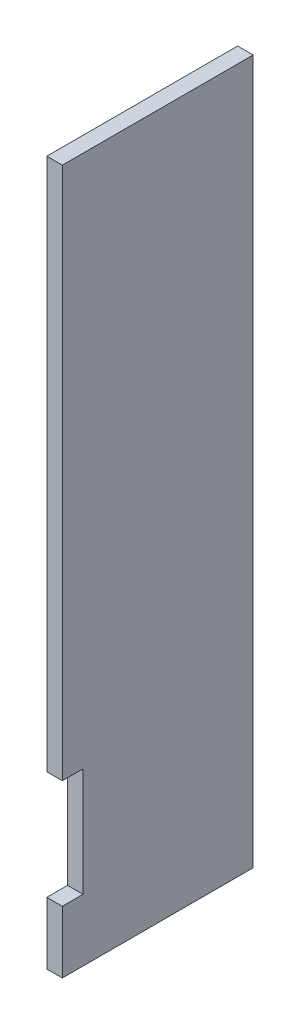
ISO-10303-21;
HEADER;
FILE_DESCRIPTION(('STEP AP214'),'2;1');
FILE_NAME('part.step','',(''),(''),'','','');
FILE_SCHEMA(('AUTOMOTIVE_DESIGN { 1 0 10303 214 1 1 1 1 }'));
ENDSEC;
DATA;
#1=APPLICATION_CONTEXT('core data for automotive mechanical design processes');
#2=APPLICATION_PROTOCOL_DEFINITION('international standard','automotive_design',2000,#1);
#3=PRODUCT_CONTEXT('',#1,'mechanical');
#4=PRODUCT('Part','Part','',(#3));
#5=PRODUCT_RELATED_PRODUCT_CATEGORY('part','',(#4));
#6=PRODUCT_DEFINITION_FORMATION('','',#4);
#7=PRODUCT_DEFINITION_CONTEXT('part definition',#1,'design');
#8=PRODUCT_DEFINITION('design','',#6,#7);
#9=PRODUCT_DEFINITION_SHAPE('','',#8);
#10=(LENGTH_UNIT() NAMED_UNIT(*) SI_UNIT(.MILLI.,.METRE.));
#11=(NAMED_UNIT(*) PLANE_ANGLE_UNIT() SI_UNIT($,.RADIAN.));
#12=(NAMED_UNIT(*) SI_UNIT($,.STERADIAN.) SOLID_ANGLE_UNIT());
#13=UNCERTAINTY_MEASURE_WITH_UNIT(LENGTH_MEASURE(1.E-05),#10,'distance_accuracy_value','');
#14=(GEOMETRIC_REPRESENTATION_CONTEXT(3) GLOBAL_UNCERTAINTY_ASSIGNED_CONTEXT((#13)) GLOBAL_UNIT_ASSIGNED_CONTEXT((#10,
#11,#12)) REPRESENTATION_CONTEXT('',''));
#15=CARTESIAN_POINT('',(0.,0.,0.));
#16=DIRECTION('',(0.,0.,1.));
#17=DIRECTION('',(1.,0.,0.));
#18=AXIS2_PLACEMENT_3D('',#15,#16,#17);
#19=CARTESIAN_POINT('',(-103.32,-116.114624464066,3.));
#20=DIRECTION('',(0.,1.,0.));
#21=DIRECTION('',(-1.,0.,0.));
#22=AXIS2_PLACEMENT_3D('',#19,#20,#21);
#23=PLANE('',#22);
#24=DIRECTION('',(1.,0.,0.));
#25=VECTOR('',#24,1.);
#26=CARTESIAN_POINT('',(-103.32,-116.114624464066,18.));
#27=LINE('',#26,#25);
#28=CARTESIAN_POINT('',(-6.31999999999994,-116.114624464066,18.));
#29=VERTEX_POINT('',#28);
#30=CARTESIAN_POINT('',(-3.31999999999993,-116.114624464066,18.));
#31=VERTEX_POINT('',#30);
#32=EDGE_CURVE('E1722',#29,#31,#27,.T.);
#33=ORIENTED_EDGE('',*,*,#32,.F.);
#34=DIRECTION('',(0.,0.,-1.));
#35=VECTOR('',#34,1.);
#36=CARTESIAN_POINT('',(-6.31999999999994,-116.114624464066,3.));
#37=LINE('',#36,#35);
#38=CARTESIAN_POINT('',(-6.31999999999994,-116.114624464066,-18.87));
#39=VERTEX_POINT('',#38);
#40=EDGE_CURVE('E1713',#29,#39,#37,.T.);
#41=ORIENTED_EDGE('',*,*,#40,.T.);
#42=DIRECTION('',(1.,0.,0.));
#43=VECTOR('',#42,1.);
#44=CARTESIAN_POINT('',(-103.18593626287,-116.114624464066,-18.87));
#45=LINE('',#44,#43);
#46=CARTESIAN_POINT('',(-3.31999999999903,-116.114624464066,-18.87));
#47=VERTEX_POINT('',#46);
#48=EDGE_CURVE('E1721',#39,#47,#45,.T.);
#49=ORIENTED_EDGE('',*,*,#48,.T.);
#50=DIRECTION('',(0.,0.,-1.));
#51=VECTOR('',#50,1.);
#52=CARTESIAN_POINT('',(-3.31999999999993,-116.114624464066,3.));
#53=LINE('',#52,#51);
#54=EDGE_CURVE('E1732',#31,#47,#53,.T.);
#55=ORIENTED_EDGE('',*,*,#54,.F.);
#56=EDGE_LOOP('',(#33,#41,#49,#55));
#57=FACE_BOUND('',#56,.T.);
#58=ADVANCED_FACE('F1642',(#57),#23,.F.);
#59=CARTESIAN_POINT('',(-103.32,19.8853755359338,-20.2264177019235));
#60=DIRECTION('',(0.,-1.,0.));
#61=DIRECTION('',(0.,0.,-1.));
#62=AXIS2_PLACEMENT_3D('',#59,#60,#61);
#63=PLANE('',#62);
#64=DIRECTION('',(-1.,0.,0.));
#65=VECTOR('',#64,1.);
#66=CARTESIAN_POINT('',(-106.64,19.8853755359338,-18.87));
#67=LINE('',#66,#65);
#68=CARTESIAN_POINT('',(-3.31999999999993,19.8853755359338,-18.87));
#69=VERTEX_POINT('',#68);
#70=CARTESIAN_POINT('',(-6.31999999999994,19.8853755359338,-18.87));
#71=VERTEX_POINT('',#70);
#72=EDGE_CURVE('E1664',#69,#71,#67,.T.);
#73=ORIENTED_EDGE('',*,*,#72,.T.);
#74=DIRECTION('',(0.,0.,1.));
#75=VECTOR('',#74,1.);
#76=CARTESIAN_POINT('',(-6.31999999999995,19.8853755359338,-175.));
#77=LINE('',#76,#75);
#78=CARTESIAN_POINT('',(-6.31999999999994,19.8853755359338,18.));
#79=VERTEX_POINT('',#78);
#80=EDGE_CURVE('E1715',#71,#79,#77,.T.);
#81=ORIENTED_EDGE('',*,*,#80,.T.);
#82=DIRECTION('',(1.,0.,0.));
#83=VECTOR('',#82,1.);
#84=CARTESIAN_POINT('',(-178.32,19.8853755359338,18.));
#85=LINE('',#84,#83);
#86=CARTESIAN_POINT('',(-3.31999999999993,19.8853755359338,18.));
#87=VERTEX_POINT('',#86);
#88=EDGE_CURVE('E1723',#79,#87,#85,.T.);
#89=ORIENTED_EDGE('',*,*,#88,.T.);
#90=DIRECTION('',(0.,0.,1.));
#91=VECTOR('',#90,1.);
#92=CARTESIAN_POINT('',(-3.31999999999993,19.8853755359338,-20.2264177019235));
#93=LINE('',#92,#91);
#94=EDGE_CURVE('E1729',#69,#87,#93,.T.);
#95=ORIENTED_EDGE('',*,*,#94,.F.);
#96=EDGE_LOOP('',(#73,#81,#89,#95));
#97=FACE_BOUND('',#96,.T.);
#98=ADVANCED_FACE('F1778',(#97),#63,.F.);
#99=CARTESIAN_POINT('',(-116.140375406953,22.8853755359338,18.));
#100=DIRECTION('',(0.,0.,-1.));
#101=DIRECTION('',(-1.,0.,0.));
#102=AXIS2_PLACEMENT_3D('',#99,#100,#101);
#103=PLANE('',#102);
#104=ORIENTED_EDGE('',*,*,#88,.F.);
#105=DIRECTION('',(0.,1.,0.));
#106=VECTOR('',#105,1.);
#107=CARTESIAN_POINT('',(-6.31999999999992,22.8853755359338,18.));
#108=LINE('',#107,#106);
#109=CARTESIAN_POINT('',(-6.31999999999992,-83.1146244640659,18.));
#110=VERTEX_POINT('',#109);
#111=EDGE_CURVE('E1748',#110,#79,#108,.T.);
#112=ORIENTED_EDGE('',*,*,#111,.F.);
#113=DIRECTION('',(1.,0.,0.));
#114=VECTOR('',#113,1.);
#115=CARTESIAN_POINT('',(-116.140375406953,-83.1146244640659,18.));
#116=LINE('',#115,#114);
#117=CARTESIAN_POINT('',(-3.31999999999993,-83.1146244640659,18.));
#118=VERTEX_POINT('',#117);
#119=EDGE_CURVE('E1728',#110,#118,#116,.T.);
#120=ORIENTED_EDGE('',*,*,#119,.T.);
#121=DIRECTION('',(0.,1.,0.));
#122=VECTOR('',#121,1.);
#123=CARTESIAN_POINT('',(-3.31999999999993,-116.114624464066,18.));
#124=LINE('',#123,#122);
#125=EDGE_CURVE('E1747',#118,#87,#124,.T.);
#126=ORIENTED_EDGE('',*,*,#125,.T.);
#127=EDGE_LOOP('',(#104,#112,#120,#126));
#128=FACE_BOUND('',#127,.T.);
#129=ADVANCED_FACE('F1782',(#128),#103,.F.);
#130=CARTESIAN_POINT('',(-6.31999999999999,22.8853755359338,-18.87));
#131=DIRECTION('',(1.,0.,0.));
#132=DIRECTION('',(0.,-1.,0.));
#133=AXIS2_PLACEMENT_3D('',#130,#131,#132);
#134=PLANE('',#133);
#135=ORIENTED_EDGE('',*,*,#111,.T.);
#136=ORIENTED_EDGE('',*,*,#80,.F.);
#137=DIRECTION('',(0.,1.,0.));
#138=VECTOR('',#137,1.);
#139=CARTESIAN_POINT('',(-6.31999999999994,-116.114624464066,-18.87));
#140=LINE('',#139,#138);
#141=EDGE_CURVE('E1708',#39,#71,#140,.T.);
#142=ORIENTED_EDGE('',*,*,#141,.F.);
#143=ORIENTED_EDGE('',*,*,#40,.F.);
#144=CARTESIAN_POINT('',(-6.31999999999992,-104.114624464066,18.));
#145=VERTEX_POINT('',#144);
#146=EDGE_CURVE('E1740',#29,#145,#108,.T.);
#147=ORIENTED_EDGE('',*,*,#146,.T.);
#148=DIRECTION('',(0.,0.,-1.));
#149=VECTOR('',#148,1.);
#150=CARTESIAN_POINT('',(-6.31999999999764,-104.114624464066,-18.87));
#151=LINE('',#150,#149);
#152=CARTESIAN_POINT('',(-6.31999999999783,-104.114624464066,14.));
#153=VERTEX_POINT('',#152);
#154=EDGE_CURVE('E1746',#145,#153,#151,.T.);
#155=ORIENTED_EDGE('',*,*,#154,.T.);
#156=DIRECTION('',(0.,1.,0.));
#157=VECTOR('',#156,1.);
#158=CARTESIAN_POINT('',(-6.31999999999999,22.8853755359338,14.));
#159=LINE('',#158,#157);
#160=CARTESIAN_POINT('',(-6.31999999999803,-83.1146244640659,14.));
#161=VERTEX_POINT('',#160);
#162=EDGE_CURVE('E13',#153,#161,#159,.T.);
#163=ORIENTED_EDGE('',*,*,#162,.T.);
#164=DIRECTION('',(0.,0.,1.));
#165=VECTOR('',#164,1.);
#166=CARTESIAN_POINT('',(-6.31999999999803,-83.1146244640659,-18.87));
#167=LINE('',#166,#165);
#168=EDGE_CURVE('E1770',#161,#110,#167,.T.);
#169=ORIENTED_EDGE('',*,*,#168,.T.);
#170=EDGE_LOOP('',(#135,#136,#142,#143,#147,#155,#163,#169));
#171=FACE_BOUND('',#170,.T.);
#172=ADVANCED_FACE('F1711',(#171),#134,.F.);
#173=ORIENTED_EDGE('',*,*,#146,.F.);
#174=ORIENTED_EDGE('',*,*,#32,.T.);
#175=CARTESIAN_POINT('',(-3.31999999999993,-104.114624464066,18.));
#176=VERTEX_POINT('',#175);
#177=EDGE_CURVE('E1742',#31,#176,#124,.T.);
#178=ORIENTED_EDGE('',*,*,#177,.T.);
#179=DIRECTION('',(-1.,0.,0.));
#180=VECTOR('',#179,1.);
#181=CARTESIAN_POINT('',(-116.140375406953,-104.114624464066,18.));
#182=LINE('',#181,#180);
#183=EDGE_CURVE('E1649',#176,#145,#182,.T.);
#184=ORIENTED_EDGE('',*,*,#183,.T.);
#185=EDGE_LOOP('',(#173,#174,#178,#184));
#186=FACE_BOUND('',#185,.T.);
#187=ADVANCED_FACE('F1739',(#186),#103,.F.);
#188=CARTESIAN_POINT('',(0.,0.,-18.87));
#189=DIRECTION('',(0.,0.,1.));
#190=DIRECTION('',(1.,0.,0.));
#191=AXIS2_PLACEMENT_3D('',#188,#189,#190);
#192=PLANE('',#191);
#193=ORIENTED_EDGE('',*,*,#48,.F.);
#194=ORIENTED_EDGE('',*,*,#141,.T.);
#195=ORIENTED_EDGE('',*,*,#72,.F.);
#196=DIRECTION('',(0.,-1.,0.));
#197=VECTOR('',#196,1.);
#198=CARTESIAN_POINT('',(-3.31999999999995,22.8853755359338,-18.87));
#199=LINE('',#198,#197);
#200=EDGE_CURVE('E1717',#69,#47,#199,.T.);
#201=ORIENTED_EDGE('',*,*,#200,.T.);
#202=EDGE_LOOP('',(#193,#194,#195,#201));
#203=FACE_BOUND('',#202,.T.);
#204=ADVANCED_FACE('F1725',(#203),#192,.F.);
#205=CARTESIAN_POINT('',(-3.31999999999993,-100.114624464066,3.));
#206=DIRECTION('',(-1.,0.,0.));
#207=DIRECTION('',(0.,0.,-1.));
#208=AXIS2_PLACEMENT_3D('',#205,#206,#207);
#209=PLANE('',#208);
#210=DIRECTION('',(0.,-1.,0.));
#211=VECTOR('',#210,1.);
#212=CARTESIAN_POINT('',(-3.31999999999993,-100.114624464066,14.));
#213=LINE('',#212,#211);
#214=CARTESIAN_POINT('',(-3.31999999999993,-83.1146244640659,14.));
#215=VERTEX_POINT('',#214);
#216=CARTESIAN_POINT('',(-3.31999999999993,-104.114624464066,14.));
#217=VERTEX_POINT('',#216);
#218=EDGE_CURVE('E1752',#215,#217,#213,.T.);
#219=ORIENTED_EDGE('',*,*,#218,.T.);
#220=DIRECTION('',(0.,0.,1.));
#221=VECTOR('',#220,1.);
#222=CARTESIAN_POINT('',(-3.31999999999993,-104.114624464066,3.));
#223=LINE('',#222,#221);
#224=EDGE_CURVE('E1764',#217,#176,#223,.T.);
#225=ORIENTED_EDGE('',*,*,#224,.T.);
#226=ORIENTED_EDGE('',*,*,#177,.F.);
#227=ORIENTED_EDGE('',*,*,#54,.T.);
#228=ORIENTED_EDGE('',*,*,#200,.F.);
#229=ORIENTED_EDGE('',*,*,#94,.T.);
#230=ORIENTED_EDGE('',*,*,#125,.F.);
#231=DIRECTION('',(0.,0.,-1.));
#232=VECTOR('',#231,1.);
#233=CARTESIAN_POINT('',(-3.31999999999993,-83.1146244640659,3.));
#234=LINE('',#233,#232);
#235=EDGE_CURVE('E1656',#118,#215,#234,.T.);
#236=ORIENTED_EDGE('',*,*,#235,.T.);
#237=EDGE_LOOP('',(#219,#225,#226,#227,#228,#229,#230,#236));
#238=FACE_BOUND('',#237,.T.);
#239=ADVANCED_FACE('F1763',(#238),#209,.F.);
#240=CARTESIAN_POINT('',(41.68,-104.114624464066,14.));
#241=DIRECTION('',(0.,-1.,0.));
#242=DIRECTION('',(0.,0.,-1.));
#243=AXIS2_PLACEMENT_3D('',#240,#241,#242);
#244=PLANE('',#243);
#245=DIRECTION('',(-1.,0.,0.));
#246=VECTOR('',#245,1.);
#247=CARTESIAN_POINT('',(41.68,-104.114624464066,14.));
#248=LINE('',#247,#246);
#249=EDGE_CURVE('E1773',#217,#153,#248,.T.);
#250=ORIENTED_EDGE('',*,*,#249,.T.);
#251=ORIENTED_EDGE('',*,*,#154,.F.);
#252=ORIENTED_EDGE('',*,*,#183,.F.);
#253=ORIENTED_EDGE('',*,*,#224,.F.);
#254=EDGE_LOOP('',(#250,#251,#252,#253));
#255=FACE_BOUND('',#254,.T.);
#256=ADVANCED_FACE('F1786',(#255),#244,.F.);
#257=CARTESIAN_POINT('',(41.68,-83.1146244640659,18.));
#258=DIRECTION('',(0.,1.,0.));
#259=DIRECTION('',(0.,0.,1.));
#260=AXIS2_PLACEMENT_3D('',#257,#258,#259);
#261=PLANE('',#260);
#262=ORIENTED_EDGE('',*,*,#119,.F.);
#263=ORIENTED_EDGE('',*,*,#168,.F.);
#264=DIRECTION('',(-1.,0.,0.));
#265=VECTOR('',#264,1.);
#266=CARTESIAN_POINT('',(41.68,-83.1146244640659,14.));
#267=LINE('',#266,#265);
#268=EDGE_CURVE('E1774',#215,#161,#267,.T.);
#269=ORIENTED_EDGE('',*,*,#268,.F.);
#270=ORIENTED_EDGE('',*,*,#235,.F.);
#271=EDGE_LOOP('',(#262,#263,#269,#270));
#272=FACE_BOUND('',#271,.T.);
#273=ADVANCED_FACE('F1783',(#272),#261,.F.);
#274=CARTESIAN_POINT('',(41.68,-83.1146244640659,14.));
#275=DIRECTION('',(0.,0.,-1.));
#276=DIRECTION('',(0.,1.,0.));
#277=AXIS2_PLACEMENT_3D('',#274,#275,#276);
#278=PLANE('',#277);
#279=ORIENTED_EDGE('',*,*,#268,.T.);
#280=ORIENTED_EDGE('',*,*,#162,.F.);
#281=ORIENTED_EDGE('',*,*,#249,.F.);
#282=ORIENTED_EDGE('',*,*,#218,.F.);
#283=EDGE_LOOP('',(#279,#280,#281,#282));
#284=FACE_BOUND('',#283,.T.);
#285=ADVANCED_FACE('F1785',(#284),#278,.F.);
#286=CLOSED_SHELL('',(#58,#98,#129,#172,#187,#204,#239,#256,#273,#285));
#287=MANIFOLD_SOLID_BREP('B2',#286);
#288=ADVANCED_BREP_SHAPE_REPRESENTATION('',(#18,#287),#14);
#289=SHAPE_DEFINITION_REPRESENTATION(#9,#288);
ENDSEC;
END-ISO-10303-21;
